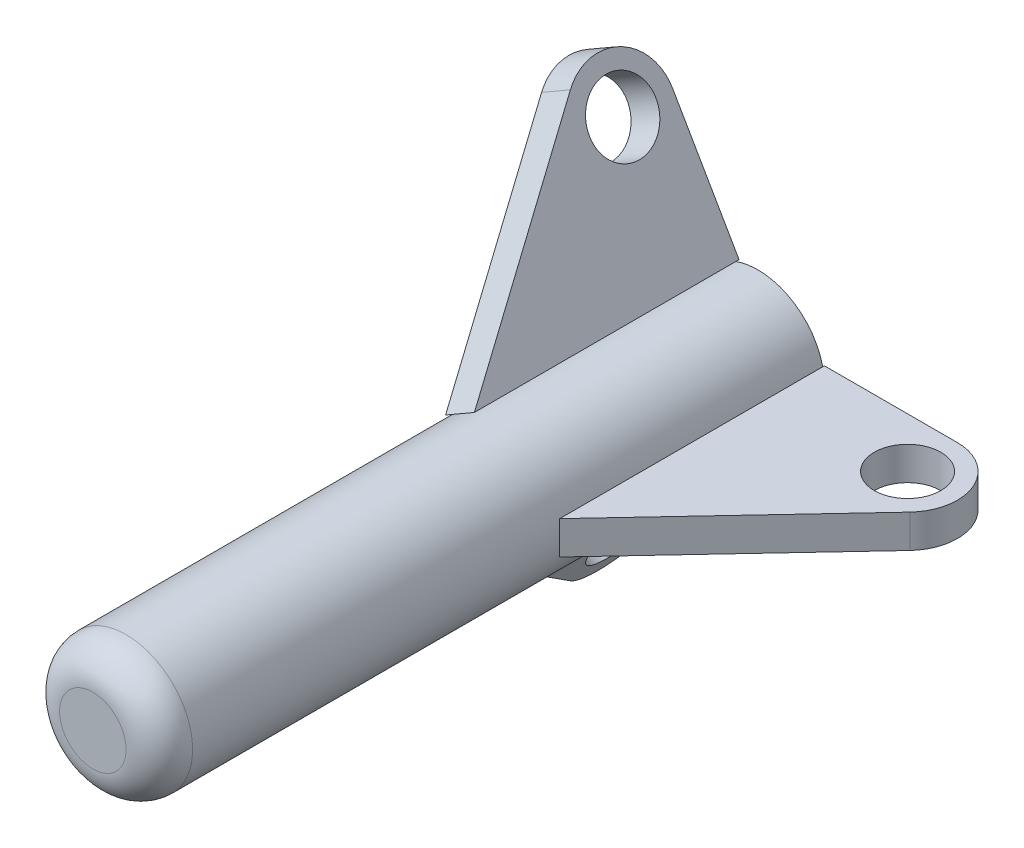
ISO-10303-21;
HEADER;
FILE_DESCRIPTION(('STEP AP214'),'2;1');
FILE_NAME('part.step','',(''),(''),'','','');
FILE_SCHEMA(('AUTOMOTIVE_DESIGN { 1 0 10303 214 1 1 1 1 }'));
ENDSEC;
DATA;
#1=APPLICATION_CONTEXT('core data for automotive mechanical design processes');
#2=APPLICATION_PROTOCOL_DEFINITION('international standard','automotive_design',2000,#1);
#3=PRODUCT_CONTEXT('',#1,'mechanical');
#4=PRODUCT('Part','Part','',(#3));
#5=PRODUCT_RELATED_PRODUCT_CATEGORY('part','',(#4));
#6=PRODUCT_DEFINITION_FORMATION('','',#4);
#7=PRODUCT_DEFINITION_CONTEXT('part definition',#1,'design');
#8=PRODUCT_DEFINITION('design','',#6,#7);
#9=PRODUCT_DEFINITION_SHAPE('','',#8);
#10=(LENGTH_UNIT() NAMED_UNIT(*) SI_UNIT(.MILLI.,.METRE.));
#11=(NAMED_UNIT(*) PLANE_ANGLE_UNIT() SI_UNIT($,.RADIAN.));
#12=(NAMED_UNIT(*) SI_UNIT($,.STERADIAN.) SOLID_ANGLE_UNIT());
#13=UNCERTAINTY_MEASURE_WITH_UNIT(LENGTH_MEASURE(1.E-05),#10,'distance_accuracy_value','');
#14=(GEOMETRIC_REPRESENTATION_CONTEXT(3) GLOBAL_UNCERTAINTY_ASSIGNED_CONTEXT((#13)) GLOBAL_UNIT_ASSIGNED_CONTEXT((#10,
#11,#12)) REPRESENTATION_CONTEXT('',''));
#15=CARTESIAN_POINT('',(0.,0.,0.));
#16=DIRECTION('',(0.,0.,1.));
#17=DIRECTION('',(1.,0.,0.));
#18=AXIS2_PLACEMENT_3D('',#15,#16,#17);
#19=CARTESIAN_POINT('',(-25.6698729810773,-54.4615242270666,15.));
#20=DIRECTION('',(-0.866025403784443,0.499999999999992,0.));
#21=DIRECTION('',(0.,0.,-1.));
#22=AXIS2_PLACEMENT_3D('',#19,#20,#21);
#23=CYLINDRICAL_SURFACE('',#22,15.);
#24=CARTESIAN_POINT('',(-34.3301270189217,-49.4615242270666,15.));
#25=DIRECTION('',(0.866025403784443,-0.499999999999992,0.));
#26=DIRECTION('',(0.,0.,1.));
#27=AXIS2_PLACEMENT_3D('',#24,#25,#26);
#28=CIRCLE('',#27,15.);
#29=CARTESIAN_POINT('',(-34.3301270189217,-49.4615242270666,0.));
#30=VERTEX_POINT('',#29);
#31=CARTESIAN_POINT('',(-39.8017324054678,-58.9386227555322,25.2589540390664));
#32=VERTEX_POINT('',#31);
#33=EDGE_CURVE('E117',#30,#32,#28,.F.);
#34=ORIENTED_EDGE('',*,*,#33,.F.);
#35=DIRECTION('',(-0.866025403784443,0.499999999999992,0.));
#36=VECTOR('',#35,1.);
#37=CARTESIAN_POINT('',(-25.6698729810773,-54.4615242270666,0.));
#38=LINE('',#37,#36);
#39=CARTESIAN_POINT('',(-25.6698729810773,-54.4615242270666,0.));
#40=VERTEX_POINT('',#39);
#41=EDGE_CURVE('E12',#40,#30,#38,.T.);
#42=ORIENTED_EDGE('',*,*,#41,.F.);
#43=CARTESIAN_POINT('',(-25.6698729810773,-54.4615242270666,15.));
#44=DIRECTION('',(0.866025403784443,-0.499999999999992,0.));
#45=DIRECTION('',(0.,0.,1.));
#46=AXIS2_PLACEMENT_3D('',#43,#44,#45);
#47=CIRCLE('',#46,15.);
#48=CARTESIAN_POINT('',(-31.1414783676234,-63.9386227555321,25.2589540390664));
#49=VERTEX_POINT('',#48);
#50=EDGE_CURVE('E107',#40,#49,#47,.F.);
#51=ORIENTED_EDGE('',*,*,#50,.T.);
#52=DIRECTION('',(-0.866025403784443,0.499999999999992,0.));
#53=VECTOR('',#52,1.);
#54=CARTESIAN_POINT('',(-31.1414783676234,-63.9386227555321,25.2589540390664));
#55=LINE('',#54,#53);
#56=EDGE_CURVE('E65',#49,#32,#55,.T.);
#57=ORIENTED_EDGE('',*,*,#56,.T.);
#58=EDGE_LOOP('',(#34,#42,#51,#57));
#59=FACE_BOUND('',#58,.T.);
#60=ADVANCED_FACE('F48',(#59),#23,.T.);
#61=CARTESIAN_POINT('',(4.33012701892222,-2.49999999999996,0.));
#62=DIRECTION('',(0.,0.,-1.));
#63=DIRECTION('',(0.499999999999992,0.866025403784443,0.));
#64=AXIS2_PLACEMENT_3D('',#61,#62,#63);
#65=PLANE('',#64);
#66=DIRECTION('',(-0.499999999999992,-0.866025403784443,0.));
#67=VECTOR('',#66,1.);
#68=CARTESIAN_POINT('',(-4.33012701892222,2.49999999999996,0.));
#69=LINE('',#68,#67);
#70=CARTESIAN_POINT('',(-14.3301270189221,-14.8205080756889,0.));
#71=VERTEX_POINT('',#70);
#72=EDGE_CURVE('E97',#71,#30,#69,.T.);
#73=ORIENTED_EDGE('',*,*,#72,.F.);
#74=DIRECTION('',(-0.866025403784443,0.499999999999992,0.));
#75=VECTOR('',#74,1.);
#76=CARTESIAN_POINT('',(-5.66987298107762,-19.8205080756888,0.));
#77=LINE('',#76,#75);
#78=CARTESIAN_POINT('',(-5.66987298107762,-19.8205080756888,0.));
#79=VERTEX_POINT('',#78);
#80=EDGE_CURVE('E57',#79,#71,#77,.T.);
#81=ORIENTED_EDGE('',*,*,#80,.F.);
#82=DIRECTION('',(-0.499999999999992,-0.866025403784443,0.));
#83=VECTOR('',#82,1.);
#84=CARTESIAN_POINT('',(4.33012701892222,-2.49999999999996,0.));
#85=LINE('',#84,#83);
#86=EDGE_CURVE('E95',#79,#40,#85,.T.);
#87=ORIENTED_EDGE('',*,*,#86,.T.);
#88=ORIENTED_EDGE('',*,*,#41,.T.);
#89=EDGE_LOOP('',(#73,#81,#87,#88));
#90=FACE_BOUND('',#89,.T.);
#91=ADVANCED_FACE('F93',(#90),#65,.T.);
#92=CARTESIAN_POINT('',(-5.66987298107762,-19.8205080756888,0.));
#93=DIRECTION('',(-0.499999999999992,-0.866025403784443,0.));
#94=DIRECTION('',(0.,0.,-1.));
#95=AXIS2_PLACEMENT_3D('',#92,#93,#94);
#96=PLANE('',#95);
#97=DIRECTION('',(0.,0.,1.));
#98=VECTOR('',#97,1.);
#99=CARTESIAN_POINT('',(-14.3301270189221,-14.8205080756889,0.));
#100=LINE('',#99,#98);
#101=CARTESIAN_POINT('',(-14.3301270189221,-14.8205080756889,79.6));
#102=VERTEX_POINT('',#101);
#103=EDGE_CURVE('E120',#71,#102,#100,.T.);
#104=ORIENTED_EDGE('',*,*,#103,.T.);
#105=DIRECTION('',(-0.866025403784443,0.499999999999992,0.));
#106=VECTOR('',#105,1.);
#107=CARTESIAN_POINT('',(-5.66987298107762,-19.8205080756888,79.6));
#108=LINE('',#107,#106);
#109=CARTESIAN_POINT('',(-5.66987298107762,-19.8205080756888,79.6));
#110=VERTEX_POINT('',#109);
#111=EDGE_CURVE('E79',#110,#102,#108,.T.);
#112=ORIENTED_EDGE('',*,*,#111,.F.);
#113=DIRECTION('',(0.,0.,1.));
#114=VECTOR('',#113,1.);
#115=CARTESIAN_POINT('',(-5.66987298107762,-19.8205080756888,0.));
#116=LINE('',#115,#114);
#117=EDGE_CURVE('E100',#79,#110,#116,.T.);
#118=ORIENTED_EDGE('',*,*,#117,.F.);
#119=ORIENTED_EDGE('',*,*,#80,.T.);
#120=EDGE_LOOP('',(#104,#112,#118,#119));
#121=FACE_BOUND('',#120,.T.);
#122=ADVANCED_FACE('F101',(#121),#96,.F.);
#123=CARTESIAN_POINT('',(-25.6698729810773,-54.4615242270666,15.));
#124=DIRECTION('',(-0.866025403784443,0.499999999999992,0.));
#125=DIRECTION('',(0.,0.,-1.));
#126=AXIS2_PLACEMENT_3D('',#123,#124,#125);
#127=CYLINDRICAL_SURFACE('',#126,9.99999999999999);
#128=CARTESIAN_POINT('',(-25.6698729810773,-54.4615242270666,15.));
#129=DIRECTION('',(0.866025403784443,-0.499999999999992,0.));
#130=DIRECTION('',(0.,0.,1.));
#131=AXIS2_PLACEMENT_3D('',#128,#129,#130);
#132=CIRCLE('',#131,9.99999999999999);
#133=CARTESIAN_POINT('',(-25.6698729810773,-54.4615242270666,25.));
#134=VERTEX_POINT('',#133);
#135=EDGE_CURVE('E109',#134,#134,#132,.T.);
#136=ORIENTED_EDGE('',*,*,#135,.T.);
#137=EDGE_LOOP('',(#136));
#138=FACE_BOUND('',#137,.T.);
#139=CARTESIAN_POINT('',(-34.3301270189217,-49.4615242270666,15.));
#140=DIRECTION('',(0.866025403784443,-0.499999999999992,0.));
#141=DIRECTION('',(0.,0.,1.));
#142=AXIS2_PLACEMENT_3D('',#139,#140,#141);
#143=CIRCLE('',#142,9.99999999999999);
#144=CARTESIAN_POINT('',(-34.3301270189217,-49.4615242270666,25.));
#145=VERTEX_POINT('',#144);
#146=EDGE_CURVE('E114',#145,#145,#143,.T.);
#147=ORIENTED_EDGE('',*,*,#146,.F.);
#148=EDGE_LOOP('',(#147));
#149=FACE_BOUND('',#148,.T.);
#150=ADVANCED_FACE('F50',(#138,#149),#127,.F.);
#151=CARTESIAN_POINT('',(-20.8508565162322,-46.1147428674437,47.2129356003703));
#152=DIRECTION('',(-0.364773692436403,-0.631806568564367,0.683930269271095));
#153=DIRECTION('',(-0.341965134635542,-0.592300987605903,-0.729547384872818));
#154=AXIS2_PLACEMENT_3D('',#151,#152,#153);
#155=PLANE('',#154);
#156=DIRECTION('',(0.341965134635542,0.592300987605903,0.729547384872818));
#157=VECTOR('',#156,1.);
#158=CARTESIAN_POINT('',(-29.5111105540767,-41.1147428674438,47.2129356003703));
#159=LINE('',#158,#157);
#160=EDGE_CURVE('E122',#32,#102,#159,.T.);
#161=ORIENTED_EDGE('',*,*,#160,.F.);
#162=ORIENTED_EDGE('',*,*,#56,.F.);
#163=DIRECTION('',(0.341965134635542,0.592300987605903,0.729547384872818));
#164=VECTOR('',#163,1.);
#165=CARTESIAN_POINT('',(-20.8508565162322,-46.1147428674437,47.2129356003703));
#166=LINE('',#165,#164);
#167=EDGE_CURVE('E104',#49,#110,#166,.T.);
#168=ORIENTED_EDGE('',*,*,#167,.T.);
#169=ORIENTED_EDGE('',*,*,#111,.T.);
#170=EDGE_LOOP('',(#161,#162,#168,#169));
#171=FACE_BOUND('',#170,.T.);
#172=ADVANCED_FACE('F134',(#171),#155,.T.);
#173=CARTESIAN_POINT('',(4.33012701892222,-2.49999999999996,0.));
#174=DIRECTION('',(0.866025403784443,-0.499999999999992,0.));
#175=DIRECTION('',(0.,0.,1.));
#176=AXIS2_PLACEMENT_3D('',#173,#174,#175);
#177=PLANE('',#176);
#178=ORIENTED_EDGE('',*,*,#135,.F.);
#179=EDGE_LOOP('',(#178));
#180=FACE_BOUND('',#179,.T.);
#181=ORIENTED_EDGE('',*,*,#50,.F.);
#182=ORIENTED_EDGE('',*,*,#86,.F.);
#183=ORIENTED_EDGE('',*,*,#117,.T.);
#184=ORIENTED_EDGE('',*,*,#167,.F.);
#185=EDGE_LOOP('',(#181,#182,#183,#184));
#186=FACE_BOUND('',#185,.T.);
#187=ADVANCED_FACE('F106',(#180,#186),#177,.T.);
#188=CARTESIAN_POINT('',(-4.33012701892222,2.49999999999996,0.));
#189=DIRECTION('',(0.866025403784443,-0.499999999999992,0.));
#190=DIRECTION('',(0.,0.,1.));
#191=AXIS2_PLACEMENT_3D('',#188,#189,#190);
#192=PLANE('',#191);
#193=ORIENTED_EDGE('',*,*,#146,.T.);
#194=EDGE_LOOP('',(#193));
#195=FACE_BOUND('',#194,.T.);
#196=ORIENTED_EDGE('',*,*,#33,.T.);
#197=ORIENTED_EDGE('',*,*,#160,.T.);
#198=ORIENTED_EDGE('',*,*,#103,.F.);
#199=ORIENTED_EDGE('',*,*,#72,.T.);
#200=EDGE_LOOP('',(#196,#197,#198,#199));
#201=FACE_BOUND('',#200,.T.);
#202=ADVANCED_FACE('F133',(#195,#201),#192,.F.);
#203=CLOSED_SHELL('',(#60,#91,#122,#150,#172,#187,#202));
#204=MANIFOLD_SOLID_BREP('B2',#203);
#205=CARTESIAN_POINT('',(-34.3301270189224,49.4615242270662,15.));
#206=DIRECTION('',(0.866025403784436,0.500000000000004,0.));
#207=DIRECTION('',(0.,0.,-1.));
#208=AXIS2_PLACEMENT_3D('',#205,#206,#207);
#209=CYLINDRICAL_SURFACE('',#208,15.);
#210=CARTESIAN_POINT('',(-25.6698729810781,54.4615242270662,15.));
#211=DIRECTION('',(-0.866025403784436,-0.500000000000004,0.));
#212=DIRECTION('',(0.,0.,1.));
#213=AXIS2_PLACEMENT_3D('',#210,#211,#212);
#214=CIRCLE('',#213,15.);
#215=CARTESIAN_POINT('',(-25.6698729810781,54.4615242270662,0.));
#216=VERTEX_POINT('',#215);
#217=CARTESIAN_POINT('',(-31.1414783676243,63.9386227555317,25.2589540390664));
#218=VERTEX_POINT('',#217);
#219=EDGE_CURVE('E286',#216,#218,#214,.F.);
#220=ORIENTED_EDGE('',*,*,#219,.F.);
#221=DIRECTION('',(0.866025403784436,0.500000000000004,0.));
#222=VECTOR('',#221,1.);
#223=CARTESIAN_POINT('',(-34.3301270189224,49.4615242270662,0.));
#224=LINE('',#223,#222);
#225=CARTESIAN_POINT('',(-34.3301270189224,49.4615242270662,0.));
#226=VERTEX_POINT('',#225);
#227=EDGE_CURVE('E46',#226,#216,#224,.T.);
#228=ORIENTED_EDGE('',*,*,#227,.F.);
#229=CARTESIAN_POINT('',(-34.3301270189224,49.4615242270662,15.));
#230=DIRECTION('',(-0.866025403784436,-0.500000000000004,0.));
#231=DIRECTION('',(0.,0.,1.));
#232=AXIS2_PLACEMENT_3D('',#229,#230,#231);
#233=CIRCLE('',#232,15.);
#234=CARTESIAN_POINT('',(-39.8017324054686,58.9386227555316,25.2589540390664));
#235=VERTEX_POINT('',#234);
#236=EDGE_CURVE('E276',#226,#235,#233,.F.);
#237=ORIENTED_EDGE('',*,*,#236,.T.);
#238=DIRECTION('',(0.866025403784436,0.500000000000004,0.));
#239=VECTOR('',#238,1.);
#240=CARTESIAN_POINT('',(-39.8017324054686,58.9386227555316,25.2589540390664));
#241=LINE('',#240,#239);
#242=EDGE_CURVE('E234',#235,#218,#241,.T.);
#243=ORIENTED_EDGE('',*,*,#242,.T.);
#244=EDGE_LOOP('',(#220,#228,#237,#243));
#245=FACE_BOUND('',#244,.T.);
#246=ADVANCED_FACE('F217',(#245),#209,.T.);
#247=CARTESIAN_POINT('',(-4.33012701892218,-2.50000000000002,0.));
#248=DIRECTION('',(0.,0.,-1.));
#249=DIRECTION('',(0.500000000000004,-0.866025403784436,0.));
#250=AXIS2_PLACEMENT_3D('',#247,#248,#249);
#251=PLANE('',#250);
#252=DIRECTION('',(-0.500000000000004,0.866025403784436,0.));
#253=VECTOR('',#252,1.);
#254=CARTESIAN_POINT('',(4.33012701892218,2.50000000000002,0.));
#255=LINE('',#254,#253);
#256=CARTESIAN_POINT('',(-5.6698729810779,19.8205080756887,0.));
#257=VERTEX_POINT('',#256);
#258=EDGE_CURVE('E266',#257,#216,#255,.T.);
#259=ORIENTED_EDGE('',*,*,#258,.F.);
#260=DIRECTION('',(0.866025403784436,0.500000000000004,0.));
#261=VECTOR('',#260,1.);
#262=CARTESIAN_POINT('',(-14.3301270189223,14.8205080756887,0.));
#263=LINE('',#262,#261);
#264=CARTESIAN_POINT('',(-14.3301270189223,14.8205080756887,0.));
#265=VERTEX_POINT('',#264);
#266=EDGE_CURVE('E226',#265,#257,#263,.T.);
#267=ORIENTED_EDGE('',*,*,#266,.F.);
#268=DIRECTION('',(-0.500000000000004,0.866025403784436,0.));
#269=VECTOR('',#268,1.);
#270=CARTESIAN_POINT('',(-4.33012701892218,-2.50000000000002,0.));
#271=LINE('',#270,#269);
#272=EDGE_CURVE('E264',#265,#226,#271,.T.);
#273=ORIENTED_EDGE('',*,*,#272,.T.);
#274=ORIENTED_EDGE('',*,*,#227,.T.);
#275=EDGE_LOOP('',(#259,#267,#273,#274));
#276=FACE_BOUND('',#275,.T.);
#277=ADVANCED_FACE('F262',(#276),#251,.T.);
#278=CARTESIAN_POINT('',(-14.3301270189223,14.8205080756887,0.));
#279=DIRECTION('',(-0.500000000000004,0.866025403784436,0.));
#280=DIRECTION('',(0.,0.,-1.));
#281=AXIS2_PLACEMENT_3D('',#278,#279,#280);
#282=PLANE('',#281);
#283=DIRECTION('',(0.,0.,1.));
#284=VECTOR('',#283,1.);
#285=CARTESIAN_POINT('',(-5.6698729810779,19.8205080756887,0.));
#286=LINE('',#285,#284);
#287=CARTESIAN_POINT('',(-5.6698729810779,19.8205080756887,79.6));
#288=VERTEX_POINT('',#287);
#289=EDGE_CURVE('E289',#257,#288,#286,.T.);
#290=ORIENTED_EDGE('',*,*,#289,.T.);
#291=DIRECTION('',(0.866025403784436,0.500000000000004,0.));
#292=VECTOR('',#291,1.);
#293=CARTESIAN_POINT('',(-14.3301270189223,14.8205080756887,79.6));
#294=LINE('',#293,#292);
#295=CARTESIAN_POINT('',(-14.3301270189223,14.8205080756887,79.6));
#296=VERTEX_POINT('',#295);
#297=EDGE_CURVE('E248',#296,#288,#294,.T.);
#298=ORIENTED_EDGE('',*,*,#297,.F.);
#299=DIRECTION('',(0.,0.,1.));
#300=VECTOR('',#299,1.);
#301=CARTESIAN_POINT('',(-14.3301270189223,14.8205080756887,0.));
#302=LINE('',#301,#300);
#303=EDGE_CURVE('E269',#265,#296,#302,.T.);
#304=ORIENTED_EDGE('',*,*,#303,.F.);
#305=ORIENTED_EDGE('',*,*,#266,.T.);
#306=EDGE_LOOP('',(#290,#298,#304,#305));
#307=FACE_BOUND('',#306,.T.);
#308=ADVANCED_FACE('F270',(#307),#282,.F.);
#309=CARTESIAN_POINT('',(-34.3301270189224,49.4615242270662,15.));
#310=DIRECTION('',(0.866025403784436,0.500000000000004,0.));
#311=DIRECTION('',(0.,0.,-1.));
#312=AXIS2_PLACEMENT_3D('',#309,#310,#311);
#313=CYLINDRICAL_SURFACE('',#312,9.99999999999999);
#314=CARTESIAN_POINT('',(-34.3301270189224,49.4615242270662,15.));
#315=DIRECTION('',(-0.866025403784436,-0.500000000000004,0.));
#316=DIRECTION('',(0.,0.,1.));
#317=AXIS2_PLACEMENT_3D('',#314,#315,#316);
#318=CIRCLE('',#317,9.99999999999999);
#319=CARTESIAN_POINT('',(-34.3301270189224,49.4615242270662,25.));
#320=VERTEX_POINT('',#319);
#321=EDGE_CURVE('E278',#320,#320,#318,.T.);
#322=ORIENTED_EDGE('',*,*,#321,.T.);
#323=EDGE_LOOP('',(#322));
#324=FACE_BOUND('',#323,.T.);
#325=CARTESIAN_POINT('',(-25.6698729810781,54.4615242270662,15.));
#326=DIRECTION('',(-0.866025403784436,-0.500000000000004,0.));
#327=DIRECTION('',(0.,0.,1.));
#328=AXIS2_PLACEMENT_3D('',#325,#326,#327);
#329=CIRCLE('',#328,9.99999999999999);
#330=CARTESIAN_POINT('',(-25.6698729810781,54.4615242270662,25.));
#331=VERTEX_POINT('',#330);
#332=EDGE_CURVE('E283',#331,#331,#329,.T.);
#333=ORIENTED_EDGE('',*,*,#332,.F.);
#334=EDGE_LOOP('',(#333));
#335=FACE_BOUND('',#334,.T.);
#336=ADVANCED_FACE('F219',(#324,#335),#313,.F.);
#337=CARTESIAN_POINT('',(-29.5111105540772,41.1147428674434,47.2129356003703));
#338=DIRECTION('',(-0.364773692436412,0.631806568564362,0.683930269271095));
#339=DIRECTION('',(-0.34196513463555,0.592300987605898,-0.729547384872818));
#340=AXIS2_PLACEMENT_3D('',#337,#338,#339);
#341=PLANE('',#340);
#342=DIRECTION('',(0.34196513463555,-0.592300987605898,0.729547384872818));
#343=VECTOR('',#342,1.);
#344=CARTESIAN_POINT('',(-20.8508565162329,46.1147428674435,47.2129356003703));
#345=LINE('',#344,#343);
#346=EDGE_CURVE('E291',#218,#288,#345,.T.);
#347=ORIENTED_EDGE('',*,*,#346,.F.);
#348=ORIENTED_EDGE('',*,*,#242,.F.);
#349=DIRECTION('',(0.34196513463555,-0.592300987605898,0.729547384872818));
#350=VECTOR('',#349,1.);
#351=CARTESIAN_POINT('',(-29.5111105540772,41.1147428674434,47.2129356003703));
#352=LINE('',#351,#350);
#353=EDGE_CURVE('E273',#235,#296,#352,.T.);
#354=ORIENTED_EDGE('',*,*,#353,.T.);
#355=ORIENTED_EDGE('',*,*,#297,.T.);
#356=EDGE_LOOP('',(#347,#348,#354,#355));
#357=FACE_BOUND('',#356,.T.);
#358=ADVANCED_FACE('F303',(#357),#341,.T.);
#359=CARTESIAN_POINT('',(-4.33012701892218,-2.50000000000002,0.));
#360=DIRECTION('',(-0.866025403784436,-0.500000000000004,0.));
#361=DIRECTION('',(0.,0.,1.));
#362=AXIS2_PLACEMENT_3D('',#359,#360,#361);
#363=PLANE('',#362);
#364=ORIENTED_EDGE('',*,*,#321,.F.);
#365=EDGE_LOOP('',(#364));
#366=FACE_BOUND('',#365,.T.);
#367=ORIENTED_EDGE('',*,*,#236,.F.);
#368=ORIENTED_EDGE('',*,*,#272,.F.);
#369=ORIENTED_EDGE('',*,*,#303,.T.);
#370=ORIENTED_EDGE('',*,*,#353,.F.);
#371=EDGE_LOOP('',(#367,#368,#369,#370));
#372=FACE_BOUND('',#371,.T.);
#373=ADVANCED_FACE('F275',(#366,#372),#363,.T.);
#374=CARTESIAN_POINT('',(4.33012701892218,2.50000000000002,0.));
#375=DIRECTION('',(-0.866025403784436,-0.500000000000004,0.));
#376=DIRECTION('',(0.,0.,1.));
#377=AXIS2_PLACEMENT_3D('',#374,#375,#376);
#378=PLANE('',#377);
#379=ORIENTED_EDGE('',*,*,#332,.T.);
#380=EDGE_LOOP('',(#379));
#381=FACE_BOUND('',#380,.T.);
#382=ORIENTED_EDGE('',*,*,#219,.T.);
#383=ORIENTED_EDGE('',*,*,#346,.T.);
#384=ORIENTED_EDGE('',*,*,#289,.F.);
#385=ORIENTED_EDGE('',*,*,#258,.T.);
#386=EDGE_LOOP('',(#382,#383,#384,#385));
#387=FACE_BOUND('',#386,.T.);
#388=ADVANCED_FACE('F302',(#381,#387),#378,.F.);
#389=CLOSED_SHELL('',(#246,#277,#308,#336,#358,#373,#388));
#390=MANIFOLD_SOLID_BREP('B6',#389);
#391=CARTESIAN_POINT('',(60.,5.,15.));
#392=DIRECTION('',(0.,-1.,0.));
#393=DIRECTION('',(0.,0.,-1.));
#394=AXIS2_PLACEMENT_3D('',#391,#392,#393);
#395=CYLINDRICAL_SURFACE('',#394,15.);
#396=CARTESIAN_POINT('',(60.,-5.,15.));
#397=DIRECTION('',(0.,1.,0.));
#398=DIRECTION('',(0.,0.,1.));
#399=AXIS2_PLACEMENT_3D('',#396,#397,#398);
#400=CIRCLE('',#399,15.);
#401=CARTESIAN_POINT('',(60.,-5.,0.));
#402=VERTEX_POINT('',#401);
#403=CARTESIAN_POINT('',(70.9432107730923,-5.,25.2589540390664));
#404=VERTEX_POINT('',#403);
#405=EDGE_CURVE('E452',#402,#404,#400,.F.);
#406=ORIENTED_EDGE('',*,*,#405,.F.);
#407=DIRECTION('',(0.,-1.,0.));
#408=VECTOR('',#407,1.);
#409=CARTESIAN_POINT('',(60.,5.,0.));
#410=LINE('',#409,#408);
#411=CARTESIAN_POINT('',(60.,5.,0.));
#412=VERTEX_POINT('',#411);
#413=EDGE_CURVE('E215',#412,#402,#410,.T.);
#414=ORIENTED_EDGE('',*,*,#413,.F.);
#415=CARTESIAN_POINT('',(60.,5.,15.));
#416=DIRECTION('',(0.,1.,0.));
#417=DIRECTION('',(0.,0.,1.));
#418=AXIS2_PLACEMENT_3D('',#415,#416,#417);
#419=CIRCLE('',#418,15.);
#420=CARTESIAN_POINT('',(70.9432107730923,5.,25.2589540390664));
#421=VERTEX_POINT('',#420);
#422=EDGE_CURVE('E442',#412,#421,#419,.F.);
#423=ORIENTED_EDGE('',*,*,#422,.T.);
#424=DIRECTION('',(0.,-1.,0.));
#425=VECTOR('',#424,1.);
#426=CARTESIAN_POINT('',(70.9432107730923,5.,25.2589540390664));
#427=LINE('',#426,#425);
#428=EDGE_CURVE('E400',#421,#404,#427,.T.);
#429=ORIENTED_EDGE('',*,*,#428,.T.);
#430=EDGE_LOOP('',(#406,#414,#423,#429));
#431=FACE_BOUND('',#430,.T.);
#432=ADVANCED_FACE('F383',(#431),#395,.T.);
#433=CARTESIAN_POINT('',(0.,5.,0.));
#434=DIRECTION('',(0.,0.,-1.));
#435=DIRECTION('',(-1.,0.,0.));
#436=AXIS2_PLACEMENT_3D('',#433,#434,#435);
#437=PLANE('',#436);
#438=DIRECTION('',(1.,0.,0.));
#439=VECTOR('',#438,1.);
#440=CARTESIAN_POINT('',(0.,-5.,0.));
#441=LINE('',#440,#439);
#442=CARTESIAN_POINT('',(20.,-5.,0.));
#443=VERTEX_POINT('',#442);
#444=EDGE_CURVE('E432',#443,#402,#441,.T.);
#445=ORIENTED_EDGE('',*,*,#444,.F.);
#446=DIRECTION('',(0.,-1.,0.));
#447=VECTOR('',#446,1.);
#448=CARTESIAN_POINT('',(20.,5.,0.));
#449=LINE('',#448,#447);
#450=CARTESIAN_POINT('',(20.,5.,0.));
#451=VERTEX_POINT('',#450);
#452=EDGE_CURVE('E392',#451,#443,#449,.T.);
#453=ORIENTED_EDGE('',*,*,#452,.F.);
#454=DIRECTION('',(1.,0.,0.));
#455=VECTOR('',#454,1.);
#456=CARTESIAN_POINT('',(0.,5.,0.));
#457=LINE('',#456,#455);
#458=EDGE_CURVE('E430',#451,#412,#457,.T.);
#459=ORIENTED_EDGE('',*,*,#458,.T.);
#460=ORIENTED_EDGE('',*,*,#413,.T.);
#461=EDGE_LOOP('',(#445,#453,#459,#460));
#462=FACE_BOUND('',#461,.T.);
#463=ADVANCED_FACE('F428',(#462),#437,.T.);
#464=CARTESIAN_POINT('',(20.,5.,0.));
#465=DIRECTION('',(1.,0.,0.));
#466=DIRECTION('',(0.,0.,-1.));
#467=AXIS2_PLACEMENT_3D('',#464,#465,#466);
#468=PLANE('',#467);
#469=DIRECTION('',(0.,0.,1.));
#470=VECTOR('',#469,1.);
#471=CARTESIAN_POINT('',(20.,-5.,0.));
#472=LINE('',#471,#470);
#473=CARTESIAN_POINT('',(20.,-5.,79.6));
#474=VERTEX_POINT('',#473);
#475=EDGE_CURVE('E455',#443,#474,#472,.T.);
#476=ORIENTED_EDGE('',*,*,#475,.T.);
#477=DIRECTION('',(0.,-1.,0.));
#478=VECTOR('',#477,1.);
#479=CARTESIAN_POINT('',(20.,5.,79.6));
#480=LINE('',#479,#478);
#481=CARTESIAN_POINT('',(20.,5.,79.6));
#482=VERTEX_POINT('',#481);
#483=EDGE_CURVE('E414',#482,#474,#480,.T.);
#484=ORIENTED_EDGE('',*,*,#483,.F.);
#485=DIRECTION('',(0.,0.,1.));
#486=VECTOR('',#485,1.);
#487=CARTESIAN_POINT('',(20.,5.,0.));
#488=LINE('',#487,#486);
#489=EDGE_CURVE('E435',#451,#482,#488,.T.);
#490=ORIENTED_EDGE('',*,*,#489,.F.);
#491=ORIENTED_EDGE('',*,*,#452,.T.);
#492=EDGE_LOOP('',(#476,#484,#490,#491));
#493=FACE_BOUND('',#492,.T.);
#494=ADVANCED_FACE('F436',(#493),#468,.F.);
#495=CARTESIAN_POINT('',(60.,5.,15.));
#496=DIRECTION('',(0.,-1.,0.));
#497=DIRECTION('',(0.,0.,-1.));
#498=AXIS2_PLACEMENT_3D('',#495,#496,#497);
#499=CYLINDRICAL_SURFACE('',#498,9.99999999999999);
#500=CARTESIAN_POINT('',(60.,5.,15.));
#501=DIRECTION('',(0.,1.,0.));
#502=DIRECTION('',(0.,0.,1.));
#503=AXIS2_PLACEMENT_3D('',#500,#501,#502);
#504=CIRCLE('',#503,9.99999999999999);
#505=CARTESIAN_POINT('',(60.,5.,25.));
#506=VERTEX_POINT('',#505);
#507=EDGE_CURVE('E444',#506,#506,#504,.T.);
#508=ORIENTED_EDGE('',*,*,#507,.T.);
#509=EDGE_LOOP('',(#508));
#510=FACE_BOUND('',#509,.T.);
#511=CARTESIAN_POINT('',(60.,-5.,15.));
#512=DIRECTION('',(0.,1.,0.));
#513=DIRECTION('',(0.,0.,1.));
#514=AXIS2_PLACEMENT_3D('',#511,#512,#513);
#515=CIRCLE('',#514,9.99999999999999);
#516=CARTESIAN_POINT('',(60.,-5.,25.));
#517=VERTEX_POINT('',#516);
#518=EDGE_CURVE('E449',#517,#517,#515,.T.);
#519=ORIENTED_EDGE('',*,*,#518,.F.);
#520=EDGE_LOOP('',(#519));
#521=FACE_BOUND('',#520,.T.);
#522=ADVANCED_FACE('F385',(#510,#521),#499,.F.);
#523=CARTESIAN_POINT('',(50.3619670703097,5.,47.2129356003703));
#524=DIRECTION('',(0.729547384872818,0.,0.683930269271095));
#525=DIRECTION('',(0.683930269271095,0.,-0.729547384872818));
#526=AXIS2_PLACEMENT_3D('',#523,#524,#525);
#527=PLANE('',#526);
#528=DIRECTION('',(-0.683930269271095,0.,0.729547384872818));
#529=VECTOR('',#528,1.);
#530=CARTESIAN_POINT('',(50.3619670703097,-5.,47.2129356003703));
#531=LINE('',#530,#529);
#532=EDGE_CURVE('E457',#404,#474,#531,.T.);
#533=ORIENTED_EDGE('',*,*,#532,.F.);
#534=ORIENTED_EDGE('',*,*,#428,.F.);
#535=DIRECTION('',(-0.683930269271095,0.,0.729547384872818));
#536=VECTOR('',#535,1.);
#537=CARTESIAN_POINT('',(50.3619670703097,5.,47.2129356003703));
#538=LINE('',#537,#536);
#539=EDGE_CURVE('E439',#421,#482,#538,.T.);
#540=ORIENTED_EDGE('',*,*,#539,.T.);
#541=ORIENTED_EDGE('',*,*,#483,.T.);
#542=EDGE_LOOP('',(#533,#534,#540,#541));
#543=FACE_BOUND('',#542,.T.);
#544=ADVANCED_FACE('F469',(#543),#527,.T.);
#545=CARTESIAN_POINT('',(0.,5.,0.));
#546=DIRECTION('',(0.,1.,0.));
#547=DIRECTION('',(0.,0.,1.));
#548=AXIS2_PLACEMENT_3D('',#545,#546,#547);
#549=PLANE('',#548);
#550=ORIENTED_EDGE('',*,*,#507,.F.);
#551=EDGE_LOOP('',(#550));
#552=FACE_BOUND('',#551,.T.);
#553=ORIENTED_EDGE('',*,*,#422,.F.);
#554=ORIENTED_EDGE('',*,*,#458,.F.);
#555=ORIENTED_EDGE('',*,*,#489,.T.);
#556=ORIENTED_EDGE('',*,*,#539,.F.);
#557=EDGE_LOOP('',(#553,#554,#555,#556));
#558=FACE_BOUND('',#557,.T.);
#559=ADVANCED_FACE('F441',(#552,#558),#549,.T.);
#560=CARTESIAN_POINT('',(0.,-5.,0.));
#561=DIRECTION('',(0.,1.,0.));
#562=DIRECTION('',(0.,0.,1.));
#563=AXIS2_PLACEMENT_3D('',#560,#561,#562);
#564=PLANE('',#563);
#565=ORIENTED_EDGE('',*,*,#518,.T.);
#566=EDGE_LOOP('',(#565));
#567=FACE_BOUND('',#566,.T.);
#568=ORIENTED_EDGE('',*,*,#405,.T.);
#569=ORIENTED_EDGE('',*,*,#532,.T.);
#570=ORIENTED_EDGE('',*,*,#475,.F.);
#571=ORIENTED_EDGE('',*,*,#444,.T.);
#572=EDGE_LOOP('',(#568,#569,#570,#571));
#573=FACE_BOUND('',#572,.T.);
#574=ADVANCED_FACE('F468',(#567,#573),#564,.F.);
#575=CLOSED_SHELL('',(#432,#463,#494,#522,#544,#559,#574));
#576=MANIFOLD_SOLID_BREP('B40',#575);
#577=CARTESIAN_POINT('',(0.,0.,200.));
#578=DIRECTION('',(0.,0.,-1.));
#579=DIRECTION('',(-1.,0.,0.));
#580=AXIS2_PLACEMENT_3D('',#577,#578,#579);
#581=CYLINDRICAL_SURFACE('',#580,20.);
#582=CARTESIAN_POINT('',(0.,0.,190.));
#583=DIRECTION('',(0.,0.,1.));
#584=DIRECTION('',(1.,0.,0.));
#585=AXIS2_PLACEMENT_3D('',#582,#583,#584);
#586=CIRCLE('',#585,20.);
#587=CARTESIAN_POINT('',(20.,0.,190.));
#588=VERTEX_POINT('',#587);
#589=EDGE_CURVE('E382',#588,#588,#586,.F.);
#590=ORIENTED_EDGE('',*,*,#589,.T.);
#591=EDGE_LOOP('',(#590));
#592=FACE_BOUND('',#591,.T.);
#593=CARTESIAN_POINT('',(0.,0.,0.));
#594=DIRECTION('',(0.,0.,1.));
#595=DIRECTION('',(1.,0.,0.));
#596=AXIS2_PLACEMENT_3D('',#593,#594,#595);
#597=CIRCLE('',#596,20.);
#598=CARTESIAN_POINT('',(20.,0.,0.));
#599=VERTEX_POINT('',#598);
#600=EDGE_CURVE('E539',#599,#599,#597,.T.);
#601=ORIENTED_EDGE('',*,*,#600,.T.);
#602=EDGE_LOOP('',(#601));
#603=FACE_BOUND('',#602,.T.);
#604=ADVANCED_FACE('F528',(#592,#603),#581,.T.);
#605=CARTESIAN_POINT('',(0.,0.,200.));
#606=DIRECTION('',(0.,0.,1.));
#607=DIRECTION('',(1.,0.,0.));
#608=AXIS2_PLACEMENT_3D('',#605,#606,#607);
#609=PLANE('',#608);
#610=CARTESIAN_POINT('',(0.,0.,200.));
#611=DIRECTION('',(0.,0.,1.));
#612=DIRECTION('',(1.,0.,0.));
#613=AXIS2_PLACEMENT_3D('',#610,#611,#612);
#614=CIRCLE('',#613,10.);
#615=CARTESIAN_POINT('',(10.,0.,200.));
#616=VERTEX_POINT('',#615);
#617=EDGE_CURVE('E535',#616,#616,#614,.T.);
#618=ORIENTED_EDGE('',*,*,#617,.T.);
#619=EDGE_LOOP('',(#618));
#620=FACE_BOUND('',#619,.T.);
#621=ADVANCED_FACE('F549',(#620),#609,.T.);
#622=CARTESIAN_POINT('',(0.,0.,0.));
#623=DIRECTION('',(0.,0.,1.));
#624=DIRECTION('',(1.,0.,0.));
#625=AXIS2_PLACEMENT_3D('',#622,#623,#624);
#626=PLANE('',#625);
#627=ORIENTED_EDGE('',*,*,#600,.F.);
#628=EDGE_LOOP('',(#627));
#629=FACE_BOUND('',#628,.T.);
#630=ADVANCED_FACE('F547',(#629),#626,.F.);
#631=CARTESIAN_POINT('',(0.,0.,190.));
#632=DIRECTION('',(0.,0.,1.));
#633=DIRECTION('',(1.,0.,0.));
#634=AXIS2_PLACEMENT_3D('',#631,#632,#633);
#635=DEGENERATE_TOROIDAL_SURFACE('',#634,10.,10.,.T.);
#636=ORIENTED_EDGE('',*,*,#589,.F.);
#637=EDGE_LOOP('',(#636));
#638=FACE_BOUND('',#637,.T.);
#639=ORIENTED_EDGE('',*,*,#617,.F.);
#640=EDGE_LOOP('',(#639));
#641=FACE_BOUND('',#640,.T.);
#642=ADVANCED_FACE('F530',(#638,#641),#635,.T.);
#643=CLOSED_SHELL('',(#604,#621,#630,#642));
#644=MANIFOLD_SOLID_BREP('B209',#643);
#645=ADVANCED_BREP_SHAPE_REPRESENTATION('',(#18,#204,#390,#576,#644),#14);
#646=SHAPE_DEFINITION_REPRESENTATION(#9,#645);
ENDSEC;
END-ISO-10303-21;
